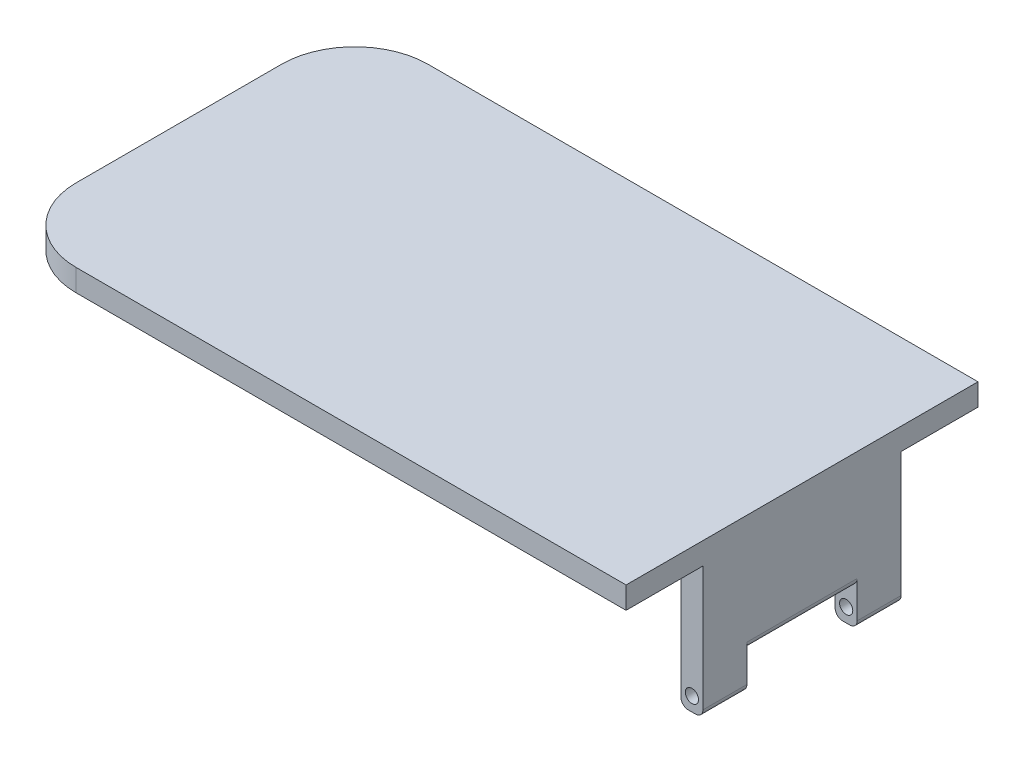
ISO-10303-21;
HEADER;
FILE_DESCRIPTION(('STEP AP214'),'2;1');
FILE_NAME('part.step','',(''),(''),'','','');
FILE_SCHEMA(('AUTOMOTIVE_DESIGN { 1 0 10303 214 1 1 1 1 }'));
ENDSEC;
DATA;
#1=APPLICATION_CONTEXT('core data for automotive mechanical design processes');
#2=APPLICATION_PROTOCOL_DEFINITION('international standard','automotive_design',2000,#1);
#3=PRODUCT_CONTEXT('',#1,'mechanical');
#4=PRODUCT('Part','Part','',(#3));
#5=PRODUCT_RELATED_PRODUCT_CATEGORY('part','',(#4));
#6=PRODUCT_DEFINITION_FORMATION('','',#4);
#7=PRODUCT_DEFINITION_CONTEXT('part definition',#1,'design');
#8=PRODUCT_DEFINITION('design','',#6,#7);
#9=PRODUCT_DEFINITION_SHAPE('','',#8);
#10=(LENGTH_UNIT() NAMED_UNIT(*) SI_UNIT(.MILLI.,.METRE.));
#11=(NAMED_UNIT(*) PLANE_ANGLE_UNIT() SI_UNIT($,.RADIAN.));
#12=(NAMED_UNIT(*) SI_UNIT($,.STERADIAN.) SOLID_ANGLE_UNIT());
#13=UNCERTAINTY_MEASURE_WITH_UNIT(LENGTH_MEASURE(1.E-05),#10,'distance_accuracy_value','');
#14=(GEOMETRIC_REPRESENTATION_CONTEXT(3) GLOBAL_UNCERTAINTY_ASSIGNED_CONTEXT((#13)) GLOBAL_UNIT_ASSIGNED_CONTEXT((#10,
#11,#12)) REPRESENTATION_CONTEXT('',''));
#15=CARTESIAN_POINT('',(0.,0.,0.));
#16=DIRECTION('',(0.,0.,1.));
#17=DIRECTION('',(1.,0.,0.));
#18=AXIS2_PLACEMENT_3D('',#15,#16,#17);
#19=CARTESIAN_POINT('',(0.,-3.,0.));
#20=DIRECTION('',(0.,-1.,0.));
#21=DIRECTION('',(0.,0.,-1.));
#22=AXIS2_PLACEMENT_3D('',#19,#20,#21);
#23=PLANE('',#22);
#24=DIRECTION('',(1.,0.,0.));
#25=VECTOR('',#24,1.);
#26=CARTESIAN_POINT('',(-42.5,-3.,24.));
#27=LINE('',#26,#25);
#28=CARTESIAN_POINT('',(-32.5,-3.,24.));
#29=VERTEX_POINT('',#28);
#30=CARTESIAN_POINT('',(2.21,-3.,24.));
#31=VERTEX_POINT('',#30);
#32=EDGE_CURVE('E344',#29,#31,#27,.T.);
#33=ORIENTED_EDGE('',*,*,#32,.F.);
#34=CARTESIAN_POINT('',(-32.5,-3.,14.));
#35=DIRECTION('',(0.,-1.,0.));
#36=DIRECTION('',(0.,0.,-1.));
#37=AXIS2_PLACEMENT_3D('',#34,#35,#36);
#38=CIRCLE('',#37,10.);
#39=CARTESIAN_POINT('',(-42.5,-3.,14.));
#40=VERTEX_POINT('',#39);
#41=EDGE_CURVE('E41',#29,#40,#38,.T.);
#42=ORIENTED_EDGE('',*,*,#41,.T.);
#43=DIRECTION('',(0.,0.,1.));
#44=VECTOR('',#43,1.);
#45=CARTESIAN_POINT('',(-42.5,-3.,-24.));
#46=LINE('',#45,#44);
#47=CARTESIAN_POINT('',(-42.5,-3.,-14.));
#48=VERTEX_POINT('',#47);
#49=EDGE_CURVE('E346',#48,#40,#46,.T.);
#50=ORIENTED_EDGE('',*,*,#49,.F.);
#51=CARTESIAN_POINT('',(-32.5,-3.,-14.));
#52=DIRECTION('',(0.,-1.,0.));
#53=DIRECTION('',(0.,0.,-1.));
#54=AXIS2_PLACEMENT_3D('',#51,#52,#53);
#55=CIRCLE('',#54,10.);
#56=CARTESIAN_POINT('',(-32.5,-3.,-24.));
#57=VERTEX_POINT('',#56);
#58=EDGE_CURVE('E449',#48,#57,#55,.T.);
#59=ORIENTED_EDGE('',*,*,#58,.T.);
#60=DIRECTION('',(1.,0.,0.));
#61=VECTOR('',#60,1.);
#62=CARTESIAN_POINT('',(-42.5,-3.,-24.));
#63=LINE('',#62,#61);
#64=CARTESIAN_POINT('',(2.21,-3.,-24.));
#65=VERTEX_POINT('',#64);
#66=EDGE_CURVE('E340',#57,#65,#63,.T.);
#67=ORIENTED_EDGE('',*,*,#66,.T.);
#68=CARTESIAN_POINT('',(2.21,-3.,0.));
#69=DIRECTION('',(0.,-1.,0.));
#70=DIRECTION('',(0.,0.,-1.));
#71=AXIS2_PLACEMENT_3D('',#68,#69,#70);
#72=CIRCLE('',#71,24.);
#73=EDGE_CURVE('E438',#65,#31,#72,.F.);
#74=ORIENTED_EDGE('',*,*,#73,.T.);
#75=EDGE_LOOP('',(#33,#42,#50,#59,#67,#74));
#76=FACE_BOUND('',#75,.T.);
#77=DIRECTION('',(1.,0.,0.));
#78=VECTOR('',#77,1.);
#79=CARTESIAN_POINT('',(-28.5,-3.,-6.89778775518108));
#80=LINE('',#79,#78);
#81=CARTESIAN_POINT('',(-28.5,-3.,-6.89778775518108));
#82=VERTEX_POINT('',#81);
#83=CARTESIAN_POINT('',(-22.5,-3.,-6.89778775518108));
#84=VERTEX_POINT('',#83);
#85=EDGE_CURVE('E252',#82,#84,#80,.T.);
#86=ORIENTED_EDGE('',*,*,#85,.F.);
#87=DIRECTION('',(0.,0.,-1.));
#88=VECTOR('',#87,1.);
#89=CARTESIAN_POINT('',(-28.5,-3.,-6.89778775518108));
#90=LINE('',#89,#88);
#91=CARTESIAN_POINT('',(-28.5,-3.,-2.50000000000001));
#92=VERTEX_POINT('',#91);
#93=EDGE_CURVE('E249',#92,#82,#90,.T.);
#94=ORIENTED_EDGE('',*,*,#93,.F.);
#95=DIRECTION('',(-1.,0.,0.));
#96=VECTOR('',#95,1.);
#97=CARTESIAN_POINT('',(-28.5,-3.,-2.50000000000001));
#98=LINE('',#97,#96);
#99=CARTESIAN_POINT('',(-22.5,-3.,-2.50000000000001));
#100=VERTEX_POINT('',#99);
#101=EDGE_CURVE('E261',#100,#92,#98,.T.);
#102=ORIENTED_EDGE('',*,*,#101,.F.);
#103=DIRECTION('',(0.,0.,1.));
#104=VECTOR('',#103,1.);
#105=CARTESIAN_POINT('',(-22.5,-3.,-6.89778775518108));
#106=LINE('',#105,#104);
#107=EDGE_CURVE('E269',#84,#100,#106,.T.);
#108=ORIENTED_EDGE('',*,*,#107,.F.);
#109=EDGE_LOOP('',(#86,#94,#102,#108));
#110=FACE_BOUND('',#109,.T.);
#111=DIRECTION('',(1.,0.,0.));
#112=VECTOR('',#111,1.);
#113=CARTESIAN_POINT('',(-28.5,-3.,2.49999999999999));
#114=LINE('',#113,#112);
#115=CARTESIAN_POINT('',(-28.5,-3.,2.49999999999999));
#116=VERTEX_POINT('',#115);
#117=CARTESIAN_POINT('',(-22.5,-3.,2.49999999999999));
#118=VERTEX_POINT('',#117);
#119=EDGE_CURVE('E770',#116,#118,#114,.T.);
#120=ORIENTED_EDGE('',*,*,#119,.F.);
#121=DIRECTION('',(0.,0.,-1.));
#122=VECTOR('',#121,1.);
#123=CARTESIAN_POINT('',(-28.5,-3.,2.49999999999999));
#124=LINE('',#123,#122);
#125=CARTESIAN_POINT('',(-28.5,-3.,6.85717531390623));
#126=VERTEX_POINT('',#125);
#127=EDGE_CURVE('E247',#126,#116,#124,.T.);
#128=ORIENTED_EDGE('',*,*,#127,.F.);
#129=DIRECTION('',(-1.,0.,0.));
#130=VECTOR('',#129,1.);
#131=CARTESIAN_POINT('',(-28.5,-3.,6.85717531390623));
#132=LINE('',#131,#130);
#133=CARTESIAN_POINT('',(-22.5,-3.,6.85717531390623));
#134=VERTEX_POINT('',#133);
#135=EDGE_CURVE('E243',#134,#126,#132,.T.);
#136=ORIENTED_EDGE('',*,*,#135,.F.);
#137=DIRECTION('',(0.,0.,1.));
#138=VECTOR('',#137,1.);
#139=CARTESIAN_POINT('',(-22.5,-3.,2.49999999999999));
#140=LINE('',#139,#138);
#141=EDGE_CURVE('E780',#118,#134,#140,.T.);
#142=ORIENTED_EDGE('',*,*,#141,.F.);
#143=EDGE_LOOP('',(#120,#128,#136,#142));
#144=FACE_BOUND('',#143,.T.);
#145=ADVANCED_FACE('F33',(#76,#110,#144),#23,.T.);
#146=CARTESIAN_POINT('',(-32.5,-3.,14.));
#147=DIRECTION('',(0.,1.,0.));
#148=DIRECTION('',(0.,0.,1.));
#149=AXIS2_PLACEMENT_3D('',#146,#147,#148);
#150=CYLINDRICAL_SURFACE('',#149,10.);
#151=DIRECTION('',(0.,1.,0.));
#152=VECTOR('',#151,1.);
#153=CARTESIAN_POINT('',(-42.5,-3.,14.));
#154=LINE('',#153,#152);
#155=CARTESIAN_POINT('',(-42.5,0.,14.));
#156=VERTEX_POINT('',#155);
#157=EDGE_CURVE('E451',#40,#156,#154,.T.);
#158=ORIENTED_EDGE('',*,*,#157,.F.);
#159=ORIENTED_EDGE('',*,*,#41,.F.);
#160=DIRECTION('',(0.,1.,0.));
#161=VECTOR('',#160,1.);
#162=CARTESIAN_POINT('',(-32.5,-3.,24.));
#163=LINE('',#162,#161);
#164=CARTESIAN_POINT('',(-32.5,0.,24.));
#165=VERTEX_POINT('',#164);
#166=EDGE_CURVE('E454',#165,#29,#163,.F.);
#167=ORIENTED_EDGE('',*,*,#166,.F.);
#168=CARTESIAN_POINT('',(-32.5,0.,14.));
#169=DIRECTION('',(0.,-1.,0.));
#170=DIRECTION('',(0.,0.,-1.));
#171=AXIS2_PLACEMENT_3D('',#168,#169,#170);
#172=CIRCLE('',#171,10.);
#173=EDGE_CURVE('E11',#156,#165,#172,.F.);
#174=ORIENTED_EDGE('',*,*,#173,.F.);
#175=EDGE_LOOP('',(#158,#159,#167,#174));
#176=FACE_BOUND('',#175,.T.);
#177=ADVANCED_FACE('F35',(#176),#150,.T.);
#178=CARTESIAN_POINT('',(-32.5,-3.,-14.));
#179=DIRECTION('',(0.,1.,0.));
#180=DIRECTION('',(0.,0.,1.));
#181=AXIS2_PLACEMENT_3D('',#178,#179,#180);
#182=CYLINDRICAL_SURFACE('',#181,10.);
#183=DIRECTION('',(0.,-1.,0.));
#184=VECTOR('',#183,1.);
#185=CARTESIAN_POINT('',(-42.5,-3.,-14.));
#186=LINE('',#185,#184);
#187=CARTESIAN_POINT('',(-42.5,0.,-14.));
#188=VERTEX_POINT('',#187);
#189=EDGE_CURVE('E441',#188,#48,#186,.T.);
#190=ORIENTED_EDGE('',*,*,#189,.F.);
#191=CARTESIAN_POINT('',(-32.5,0.,-14.));
#192=DIRECTION('',(0.,-1.,0.));
#193=DIRECTION('',(0.,0.,-1.));
#194=AXIS2_PLACEMENT_3D('',#191,#192,#193);
#195=CIRCLE('',#194,10.);
#196=CARTESIAN_POINT('',(-32.5,0.,-24.));
#197=VERTEX_POINT('',#196);
#198=EDGE_CURVE('E447',#197,#188,#195,.F.);
#199=ORIENTED_EDGE('',*,*,#198,.F.);
#200=DIRECTION('',(0.,-1.,0.));
#201=VECTOR('',#200,1.);
#202=CARTESIAN_POINT('',(-32.5,-3.,-24.));
#203=LINE('',#202,#201);
#204=EDGE_CURVE('E444',#57,#197,#203,.F.);
#205=ORIENTED_EDGE('',*,*,#204,.F.);
#206=ORIENTED_EDGE('',*,*,#58,.F.);
#207=EDGE_LOOP('',(#190,#199,#205,#206));
#208=FACE_BOUND('',#207,.T.);
#209=ADVANCED_FACE('F468',(#208),#182,.T.);
#210=CARTESIAN_POINT('',(40.5,-15.,7.52));
#211=DIRECTION('',(0.,0.,1.));
#212=DIRECTION('',(1.,0.,0.));
#213=AXIS2_PLACEMENT_3D('',#210,#211,#212);
#214=CYLINDRICAL_SURFACE('',#213,1.);
#215=DIRECTION('',(0.,0.,-1.));
#216=VECTOR('',#215,1.);
#217=CARTESIAN_POINT('',(40.5,-16.,7.52));
#218=LINE('',#217,#216);
#219=CARTESIAN_POINT('',(40.5,-16.,7.52));
#220=VERTEX_POINT('',#219);
#221=CARTESIAN_POINT('',(40.5,-16.,-7.52));
#222=VERTEX_POINT('',#221);
#223=EDGE_CURVE('E424',#220,#222,#218,.T.);
#224=ORIENTED_EDGE('',*,*,#223,.F.);
#225=CARTESIAN_POINT('',(40.5,-15.,7.52));
#226=DIRECTION('',(0.,0.,1.));
#227=DIRECTION('',(0.,-1.,0.));
#228=AXIS2_PLACEMENT_3D('',#225,#226,#227);
#229=CIRCLE('',#228,1.);
#230=CARTESIAN_POINT('',(39.5,-15.,7.52));
#231=VERTEX_POINT('',#230);
#232=EDGE_CURVE('E430',#220,#231,#229,.F.);
#233=ORIENTED_EDGE('',*,*,#232,.T.);
#234=DIRECTION('',(0.,0.,-1.));
#235=VECTOR('',#234,1.);
#236=CARTESIAN_POINT('',(39.5,-15.,7.52));
#237=LINE('',#236,#235);
#238=CARTESIAN_POINT('',(39.5,-15.,-7.52));
#239=VERTEX_POINT('',#238);
#240=EDGE_CURVE('E427',#239,#231,#237,.F.);
#241=ORIENTED_EDGE('',*,*,#240,.F.);
#242=CARTESIAN_POINT('',(40.5,-15.,-7.52));
#243=DIRECTION('',(0.,0.,1.));
#244=DIRECTION('',(1.,0.,0.));
#245=AXIS2_PLACEMENT_3D('',#242,#243,#244);
#246=CIRCLE('',#245,1.);
#247=EDGE_CURVE('E433',#239,#222,#246,.T.);
#248=ORIENTED_EDGE('',*,*,#247,.T.);
#249=EDGE_LOOP('',(#224,#233,#241,#248));
#250=FACE_BOUND('',#249,.T.);
#251=ADVANCED_FACE('F552',(#250),#214,.T.);
#252=CARTESIAN_POINT('',(41.5,-15.,7.52));
#253=DIRECTION('',(0.,0.,-1.));
#254=DIRECTION('',(-1.,0.,0.));
#255=AXIS2_PLACEMENT_3D('',#252,#253,#254);
#256=CYLINDRICAL_SURFACE('',#255,1.);
#257=DIRECTION('',(0.,0.,1.));
#258=VECTOR('',#257,1.);
#259=CARTESIAN_POINT('',(41.5,-16.,7.52));
#260=LINE('',#259,#258);
#261=CARTESIAN_POINT('',(41.5,-16.,-7.52));
#262=VERTEX_POINT('',#261);
#263=CARTESIAN_POINT('',(41.5,-16.,7.52));
#264=VERTEX_POINT('',#263);
#265=EDGE_CURVE('E412',#262,#264,#260,.T.);
#266=ORIENTED_EDGE('',*,*,#265,.F.);
#267=CARTESIAN_POINT('',(41.5,-15.,-7.52));
#268=DIRECTION('',(0.,0.,1.));
#269=DIRECTION('',(1.,0.,0.));
#270=AXIS2_PLACEMENT_3D('',#267,#268,#269);
#271=CIRCLE('',#270,1.);
#272=CARTESIAN_POINT('',(42.5,-15.,-7.52));
#273=VERTEX_POINT('',#272);
#274=EDGE_CURVE('E418',#262,#273,#271,.T.);
#275=ORIENTED_EDGE('',*,*,#274,.T.);
#276=DIRECTION('',(0.,0.,1.));
#277=VECTOR('',#276,1.);
#278=CARTESIAN_POINT('',(42.5,-15.,7.52));
#279=LINE('',#278,#277);
#280=CARTESIAN_POINT('',(42.5,-15.,7.52));
#281=VERTEX_POINT('',#280);
#282=EDGE_CURVE('E415',#281,#273,#279,.F.);
#283=ORIENTED_EDGE('',*,*,#282,.F.);
#284=CARTESIAN_POINT('',(41.5,-15.,7.52));
#285=DIRECTION('',(0.,0.,1.));
#286=DIRECTION('',(0.,-1.,0.));
#287=AXIS2_PLACEMENT_3D('',#284,#285,#286);
#288=CIRCLE('',#287,1.);
#289=EDGE_CURVE('E421',#281,#264,#288,.F.);
#290=ORIENTED_EDGE('',*,*,#289,.T.);
#291=EDGE_LOOP('',(#266,#275,#283,#290));
#292=FACE_BOUND('',#291,.T.);
#293=ADVANCED_FACE('F548',(#292),#256,.T.);
#294=CARTESIAN_POINT('',(40.5,-20.,-24.));
#295=DIRECTION('',(0.,0.,-1.));
#296=DIRECTION('',(-1.,0.,0.));
#297=AXIS2_PLACEMENT_3D('',#294,#295,#296);
#298=CYLINDRICAL_SURFACE('',#297,1.);
#299=DIRECTION('',(0.,0.,1.));
#300=VECTOR('',#299,1.);
#301=CARTESIAN_POINT('',(39.5,-20.,-24.));
#302=LINE('',#301,#300);
#303=CARTESIAN_POINT('',(39.5,-20.,7.52));
#304=VERTEX_POINT('',#303);
#305=CARTESIAN_POINT('',(39.5,-20.,13.52));
#306=VERTEX_POINT('',#305);
#307=EDGE_CURVE('E402',#304,#306,#302,.T.);
#308=ORIENTED_EDGE('',*,*,#307,.F.);
#309=CARTESIAN_POINT('',(40.5,-20.,7.52));
#310=DIRECTION('',(0.,0.,1.));
#311=DIRECTION('',(0.,-1.,0.));
#312=AXIS2_PLACEMENT_3D('',#309,#310,#311);
#313=CIRCLE('',#312,1.);
#314=CARTESIAN_POINT('',(40.5,-21.,7.52));
#315=VERTEX_POINT('',#314);
#316=EDGE_CURVE('E408',#315,#304,#313,.F.);
#317=ORIENTED_EDGE('',*,*,#316,.F.);
#318=DIRECTION('',(0.,0.,1.));
#319=VECTOR('',#318,1.);
#320=CARTESIAN_POINT('',(40.5,-21.,-24.));
#321=LINE('',#320,#319);
#322=CARTESIAN_POINT('',(40.5,-21.,13.52));
#323=VERTEX_POINT('',#322);
#324=EDGE_CURVE('E405',#323,#315,#321,.F.);
#325=ORIENTED_EDGE('',*,*,#324,.F.);
#326=CARTESIAN_POINT('',(40.5,-20.,13.52));
#327=DIRECTION('',(0.,0.,-1.));
#328=DIRECTION('',(0.,1.,0.));
#329=AXIS2_PLACEMENT_3D('',#326,#327,#328);
#330=CIRCLE('',#329,1.);
#331=EDGE_CURVE('E410',#306,#323,#330,.F.);
#332=ORIENTED_EDGE('',*,*,#331,.F.);
#333=EDGE_LOOP('',(#308,#317,#325,#332));
#334=FACE_BOUND('',#333,.T.);
#335=ADVANCED_FACE('F544',(#334),#298,.T.);
#336=CARTESIAN_POINT('',(40.5,-20.,-24.));
#337=DIRECTION('',(0.,0.,-1.));
#338=DIRECTION('',(-1.,0.,0.));
#339=AXIS2_PLACEMENT_3D('',#336,#337,#338);
#340=CYLINDRICAL_SURFACE('',#339,1.);
#341=DIRECTION('',(0.,0.,1.));
#342=VECTOR('',#341,1.);
#343=CARTESIAN_POINT('',(39.5,-20.,-24.));
#344=LINE('',#343,#342);
#345=CARTESIAN_POINT('',(39.5,-20.,-13.52));
#346=VERTEX_POINT('',#345);
#347=CARTESIAN_POINT('',(39.5,-20.,-7.52));
#348=VERTEX_POINT('',#347);
#349=EDGE_CURVE('E391',#346,#348,#344,.T.);
#350=ORIENTED_EDGE('',*,*,#349,.F.);
#351=CARTESIAN_POINT('',(40.5,-20.,-13.52));
#352=DIRECTION('',(0.,0.,-1.));
#353=DIRECTION('',(0.,1.,0.));
#354=AXIS2_PLACEMENT_3D('',#351,#352,#353);
#355=CIRCLE('',#354,1.);
#356=CARTESIAN_POINT('',(40.5,-21.,-13.52));
#357=VERTEX_POINT('',#356);
#358=EDGE_CURVE('E400',#357,#346,#355,.T.);
#359=ORIENTED_EDGE('',*,*,#358,.F.);
#360=DIRECTION('',(0.,0.,1.));
#361=VECTOR('',#360,1.);
#362=CARTESIAN_POINT('',(40.5,-21.,-24.));
#363=LINE('',#362,#361);
#364=CARTESIAN_POINT('',(40.5,-21.,-7.52));
#365=VERTEX_POINT('',#364);
#366=EDGE_CURVE('E397',#365,#357,#363,.F.);
#367=ORIENTED_EDGE('',*,*,#366,.F.);
#368=CARTESIAN_POINT('',(40.5,-20.,-7.52));
#369=DIRECTION('',(0.,0.,1.));
#370=DIRECTION('',(1.,0.,0.));
#371=AXIS2_PLACEMENT_3D('',#368,#369,#370);
#372=CIRCLE('',#371,1.);
#373=EDGE_CURVE('E394',#348,#365,#372,.T.);
#374=ORIENTED_EDGE('',*,*,#373,.F.);
#375=EDGE_LOOP('',(#350,#359,#367,#374));
#376=FACE_BOUND('',#375,.T.);
#377=ADVANCED_FACE('F540',(#376),#340,.T.);
#378=CARTESIAN_POINT('',(41.5,-20.,-24.));
#379=DIRECTION('',(0.,0.,1.));
#380=DIRECTION('',(1.,0.,0.));
#381=AXIS2_PLACEMENT_3D('',#378,#379,#380);
#382=CYLINDRICAL_SURFACE('',#381,1.);
#383=DIRECTION('',(0.,0.,-1.));
#384=VECTOR('',#383,1.);
#385=CARTESIAN_POINT('',(42.5,-20.,-24.));
#386=LINE('',#385,#384);
#387=CARTESIAN_POINT('',(42.5,-20.,13.52));
#388=VERTEX_POINT('',#387);
#389=CARTESIAN_POINT('',(42.5,-20.,7.52));
#390=VERTEX_POINT('',#389);
#391=EDGE_CURVE('E380',#388,#390,#386,.T.);
#392=ORIENTED_EDGE('',*,*,#391,.F.);
#393=CARTESIAN_POINT('',(41.5,-20.,13.52));
#394=DIRECTION('',(0.,0.,-1.));
#395=DIRECTION('',(0.,1.,0.));
#396=AXIS2_PLACEMENT_3D('',#393,#394,#395);
#397=CIRCLE('',#396,1.);
#398=CARTESIAN_POINT('',(41.5,-21.,13.52));
#399=VERTEX_POINT('',#398);
#400=EDGE_CURVE('E386',#399,#388,#397,.F.);
#401=ORIENTED_EDGE('',*,*,#400,.F.);
#402=DIRECTION('',(0.,0.,-1.));
#403=VECTOR('',#402,1.);
#404=CARTESIAN_POINT('',(41.5,-21.,-24.));
#405=LINE('',#404,#403);
#406=CARTESIAN_POINT('',(41.5,-21.,7.52));
#407=VERTEX_POINT('',#406);
#408=EDGE_CURVE('E383',#407,#399,#405,.F.);
#409=ORIENTED_EDGE('',*,*,#408,.F.);
#410=CARTESIAN_POINT('',(41.5,-20.,7.52));
#411=DIRECTION('',(0.,0.,1.));
#412=DIRECTION('',(0.,-1.,0.));
#413=AXIS2_PLACEMENT_3D('',#410,#411,#412);
#414=CIRCLE('',#413,1.);
#415=EDGE_CURVE('E388',#390,#407,#414,.F.);
#416=ORIENTED_EDGE('',*,*,#415,.F.);
#417=EDGE_LOOP('',(#392,#401,#409,#416));
#418=FACE_BOUND('',#417,.T.);
#419=ADVANCED_FACE('F536',(#418),#382,.T.);
#420=CARTESIAN_POINT('',(41.5,-20.,-24.));
#421=DIRECTION('',(0.,0.,1.));
#422=DIRECTION('',(1.,0.,0.));
#423=AXIS2_PLACEMENT_3D('',#420,#421,#422);
#424=CYLINDRICAL_SURFACE('',#423,1.);
#425=DIRECTION('',(0.,0.,-1.));
#426=VECTOR('',#425,1.);
#427=CARTESIAN_POINT('',(42.5,-20.,-24.));
#428=LINE('',#427,#426);
#429=CARTESIAN_POINT('',(42.5,-20.,-7.52));
#430=VERTEX_POINT('',#429);
#431=CARTESIAN_POINT('',(42.5,-20.,-13.52));
#432=VERTEX_POINT('',#431);
#433=EDGE_CURVE('E364',#430,#432,#428,.T.);
#434=ORIENTED_EDGE('',*,*,#433,.F.);
#435=CARTESIAN_POINT('',(41.5,-20.,-7.52));
#436=DIRECTION('',(0.,0.,1.));
#437=DIRECTION('',(1.,0.,0.));
#438=AXIS2_PLACEMENT_3D('',#435,#436,#437);
#439=CIRCLE('',#438,1.);
#440=CARTESIAN_POINT('',(41.5,-21.,-7.52));
#441=VERTEX_POINT('',#440);
#442=EDGE_CURVE('E376',#441,#430,#439,.T.);
#443=ORIENTED_EDGE('',*,*,#442,.F.);
#444=DIRECTION('',(0.,0.,-1.));
#445=VECTOR('',#444,1.);
#446=CARTESIAN_POINT('',(41.5,-21.,-24.));
#447=LINE('',#446,#445);
#448=CARTESIAN_POINT('',(41.5,-21.,-13.52));
#449=VERTEX_POINT('',#448);
#450=EDGE_CURVE('E373',#449,#441,#447,.F.);
#451=ORIENTED_EDGE('',*,*,#450,.F.);
#452=CARTESIAN_POINT('',(41.5,-20.,-13.52));
#453=DIRECTION('',(0.,0.,-1.));
#454=DIRECTION('',(0.,1.,0.));
#455=AXIS2_PLACEMENT_3D('',#452,#453,#454);
#456=CIRCLE('',#455,1.);
#457=EDGE_CURVE('E378',#432,#449,#456,.T.);
#458=ORIENTED_EDGE('',*,*,#457,.F.);
#459=EDGE_LOOP('',(#434,#443,#451,#458));
#460=FACE_BOUND('',#459,.T.);
#461=ADVANCED_FACE('F532',(#460),#424,.T.);
#462=CARTESIAN_POINT('',(0.,-21.,0.));
#463=DIRECTION('',(0.,-1.,0.));
#464=DIRECTION('',(0.,0.,-1.));
#465=AXIS2_PLACEMENT_3D('',#462,#463,#464);
#466=PLANE('',#465);
#467=DIRECTION('',(1.,0.,0.));
#468=VECTOR('',#467,1.);
#469=CARTESIAN_POINT('',(-42.5,-21.,-7.52));
#470=LINE('',#469,#468);
#471=EDGE_CURVE('E326',#365,#441,#470,.T.);
#472=ORIENTED_EDGE('',*,*,#471,.F.);
#473=ORIENTED_EDGE('',*,*,#366,.T.);
#474=DIRECTION('',(-1.,0.,0.));
#475=VECTOR('',#474,1.);
#476=CARTESIAN_POINT('',(42.5,-21.,-13.52));
#477=LINE('',#476,#475);
#478=EDGE_CURVE('E290',#449,#357,#477,.T.);
#479=ORIENTED_EDGE('',*,*,#478,.F.);
#480=ORIENTED_EDGE('',*,*,#450,.T.);
#481=EDGE_LOOP('',(#472,#473,#479,#480));
#482=FACE_BOUND('',#481,.T.);
#483=ADVANCED_FACE('F535',(#482),#466,.T.);
#484=CARTESIAN_POINT('',(41.,-19.1,-24.));
#485=DIRECTION('',(0.,0.,-1.));
#486=DIRECTION('',(-1.,0.,0.));
#487=AXIS2_PLACEMENT_3D('',#484,#485,#486);
#488=CYLINDRICAL_SURFACE('',#487,0.899999999999991);
#489=CARTESIAN_POINT('',(41.,-19.1,-7.52));
#490=DIRECTION('',(0.,0.,1.));
#491=DIRECTION('',(1.,0.,0.));
#492=AXIS2_PLACEMENT_3D('',#489,#490,#491);
#493=CIRCLE('',#492,0.899999999999991);
#494=CARTESIAN_POINT('',(41.9,-19.1,-7.52));
#495=VERTEX_POINT('',#494);
#496=EDGE_CURVE('E323',#495,#495,#493,.F.);
#497=ORIENTED_EDGE('',*,*,#496,.F.);
#498=EDGE_LOOP('',(#497));
#499=FACE_BOUND('',#498,.T.);
#500=CARTESIAN_POINT('',(41.,-19.1,-13.52));
#501=DIRECTION('',(0.,0.,-1.));
#502=DIRECTION('',(0.,1.,0.));
#503=AXIS2_PLACEMENT_3D('',#500,#501,#502);
#504=CIRCLE('',#503,0.899999999999991);
#505=CARTESIAN_POINT('',(41.,-18.2,-13.52));
#506=VERTEX_POINT('',#505);
#507=EDGE_CURVE('E311',#506,#506,#504,.F.);
#508=ORIENTED_EDGE('',*,*,#507,.F.);
#509=EDGE_LOOP('',(#508));
#510=FACE_BOUND('',#509,.T.);
#511=ADVANCED_FACE('F531',(#499,#510),#488,.F.);
#512=CARTESIAN_POINT('',(-42.5,-3.,-24.));
#513=DIRECTION('',(0.,0.,1.));
#514=DIRECTION('',(1.,0.,0.));
#515=AXIS2_PLACEMENT_3D('',#512,#513,#514);
#516=PLANE('',#515);
#517=ORIENTED_EDGE('',*,*,#66,.F.);
#518=ORIENTED_EDGE('',*,*,#204,.T.);
#519=DIRECTION('',(1.,0.,0.));
#520=VECTOR('',#519,1.);
#521=CARTESIAN_POINT('',(-42.5,0.,-24.));
#522=LINE('',#521,#520);
#523=CARTESIAN_POINT('',(42.5,0.,-24.));
#524=VERTEX_POINT('',#523);
#525=EDGE_CURVE('E339',#197,#524,#522,.T.);
#526=ORIENTED_EDGE('',*,*,#525,.T.);
#527=DIRECTION('',(0.,1.,0.));
#528=VECTOR('',#527,1.);
#529=CARTESIAN_POINT('',(42.5,-3.,-24.));
#530=LINE('',#529,#528);
#531=CARTESIAN_POINT('',(42.5,-3.,-24.));
#532=VERTEX_POINT('',#531);
#533=EDGE_CURVE('E361',#532,#524,#530,.T.);
#534=ORIENTED_EDGE('',*,*,#533,.F.);
#535=EDGE_CURVE('E343',#65,#532,#63,.T.);
#536=ORIENTED_EDGE('',*,*,#535,.F.);
#537=EDGE_LOOP('',(#517,#518,#526,#534,#536));
#538=FACE_BOUND('',#537,.T.);
#539=ADVANCED_FACE('F482',(#538),#516,.F.);
#540=CARTESIAN_POINT('',(42.5,-3.,-24.));
#541=DIRECTION('',(-1.,0.,0.));
#542=DIRECTION('',(0.,0.,1.));
#543=AXIS2_PLACEMENT_3D('',#540,#541,#542);
#544=PLANE('',#543);
#545=ORIENTED_EDGE('',*,*,#282,.T.);
#546=DIRECTION('',(0.,-1.,0.));
#547=VECTOR('',#546,1.);
#548=CARTESIAN_POINT('',(42.5,-16.,-7.52));
#549=LINE('',#548,#547);
#550=EDGE_CURVE('E317',#273,#430,#549,.T.);
#551=ORIENTED_EDGE('',*,*,#550,.T.);
#552=ORIENTED_EDGE('',*,*,#433,.T.);
#553=DIRECTION('',(0.,-1.,0.));
#554=VECTOR('',#553,1.);
#555=CARTESIAN_POINT('',(42.5,-3.00000000000001,-13.52));
#556=LINE('',#555,#554);
#557=CARTESIAN_POINT('',(42.5,-3.00000000000001,-13.52));
#558=VERTEX_POINT('',#557);
#559=EDGE_CURVE('E284',#558,#432,#556,.T.);
#560=ORIENTED_EDGE('',*,*,#559,.F.);
#561=DIRECTION('',(0.,0.,1.));
#562=VECTOR('',#561,1.);
#563=CARTESIAN_POINT('',(42.5,-3.,-24.));
#564=LINE('',#563,#562);
#565=EDGE_CURVE('E287',#532,#558,#564,.T.);
#566=ORIENTED_EDGE('',*,*,#565,.F.);
#567=ORIENTED_EDGE('',*,*,#533,.T.);
#568=DIRECTION('',(0.,0.,1.));
#569=VECTOR('',#568,1.);
#570=CARTESIAN_POINT('',(42.5,0.,-24.));
#571=LINE('',#570,#569);
#572=CARTESIAN_POINT('',(42.5,0.,24.));
#573=VERTEX_POINT('',#572);
#574=EDGE_CURVE('E351',#524,#573,#571,.T.);
#575=ORIENTED_EDGE('',*,*,#574,.T.);
#576=DIRECTION('',(0.,1.,0.));
#577=VECTOR('',#576,1.);
#578=CARTESIAN_POINT('',(42.5,-3.,24.));
#579=LINE('',#578,#577);
#580=CARTESIAN_POINT('',(42.5,-3.,24.));
#581=VERTEX_POINT('',#580);
#582=EDGE_CURVE('E349',#581,#573,#579,.T.);
#583=ORIENTED_EDGE('',*,*,#582,.F.);
#584=DIRECTION('',(0.,0.,-1.));
#585=VECTOR('',#584,1.);
#586=CARTESIAN_POINT('',(42.5,-3.,24.));
#587=LINE('',#586,#585);
#588=CARTESIAN_POINT('',(42.5,-3.,13.52));
#589=VERTEX_POINT('',#588);
#590=EDGE_CURVE('E303',#581,#589,#587,.T.);
#591=ORIENTED_EDGE('',*,*,#590,.T.);
#592=DIRECTION('',(0.,-1.,0.));
#593=VECTOR('',#592,1.);
#594=CARTESIAN_POINT('',(42.5,-3.,13.52));
#595=LINE('',#594,#593);
#596=EDGE_CURVE('E306',#589,#388,#595,.T.);
#597=ORIENTED_EDGE('',*,*,#596,.T.);
#598=ORIENTED_EDGE('',*,*,#391,.T.);
#599=DIRECTION('',(0.,-1.,0.));
#600=VECTOR('',#599,1.);
#601=CARTESIAN_POINT('',(42.5,-16.,7.52));
#602=LINE('',#601,#600);
#603=EDGE_CURVE('E314',#281,#390,#602,.T.);
#604=ORIENTED_EDGE('',*,*,#603,.F.);
#605=EDGE_LOOP('',(#545,#551,#552,#560,#566,#567,#575,#583,#591,#597,#598,#604));
#606=FACE_BOUND('',#605,.T.);
#607=ADVANCED_FACE('F525',(#606),#544,.F.);
#608=CARTESIAN_POINT('',(39.5,-21.,-24.));
#609=DIRECTION('',(1.,0.,0.));
#610=DIRECTION('',(0.,0.,-1.));
#611=AXIS2_PLACEMENT_3D('',#608,#609,#610);
#612=PLANE('',#611);
#613=ORIENTED_EDGE('',*,*,#240,.T.);
#614=DIRECTION('',(0.,-1.,0.));
#615=VECTOR('',#614,1.);
#616=CARTESIAN_POINT('',(39.5,-21.,7.52));
#617=LINE('',#616,#615);
#618=EDGE_CURVE('E333',#231,#304,#617,.T.);
#619=ORIENTED_EDGE('',*,*,#618,.T.);
#620=ORIENTED_EDGE('',*,*,#307,.T.);
#621=DIRECTION('',(0.,-1.,0.));
#622=VECTOR('',#621,1.);
#623=CARTESIAN_POINT('',(39.5,-3.,13.52));
#624=LINE('',#623,#622);
#625=CARTESIAN_POINT('',(39.5,-3.,13.52));
#626=VERTEX_POINT('',#625);
#627=EDGE_CURVE('E293',#626,#306,#624,.T.);
#628=ORIENTED_EDGE('',*,*,#627,.F.);
#629=DIRECTION('',(0.,0.,-1.));
#630=VECTOR('',#629,1.);
#631=CARTESIAN_POINT('',(39.5,-3.,-24.));
#632=LINE('',#631,#630);
#633=CARTESIAN_POINT('',(39.5,-3.00000000000001,-13.52));
#634=VERTEX_POINT('',#633);
#635=EDGE_CURVE('E336',#626,#634,#632,.T.);
#636=ORIENTED_EDGE('',*,*,#635,.T.);
#637=DIRECTION('',(0.,-1.,0.));
#638=VECTOR('',#637,1.);
#639=CARTESIAN_POINT('',(39.5,-3.00000000000001,-13.52));
#640=LINE('',#639,#638);
#641=EDGE_CURVE('E288',#634,#346,#640,.T.);
#642=ORIENTED_EDGE('',*,*,#641,.T.);
#643=ORIENTED_EDGE('',*,*,#349,.T.);
#644=DIRECTION('',(0.,-1.,0.));
#645=VECTOR('',#644,1.);
#646=CARTESIAN_POINT('',(39.5,-21.,-7.52));
#647=LINE('',#646,#645);
#648=EDGE_CURVE('E329',#239,#348,#647,.T.);
#649=ORIENTED_EDGE('',*,*,#648,.F.);
#650=EDGE_LOOP('',(#613,#619,#620,#628,#636,#642,#643,#649));
#651=FACE_BOUND('',#650,.T.);
#652=ADVANCED_FACE('F521',(#651),#612,.F.);
#653=CARTESIAN_POINT('',(-42.5,-3.,24.));
#654=DIRECTION('',(0.,0.,1.));
#655=DIRECTION('',(1.,0.,0.));
#656=AXIS2_PLACEMENT_3D('',#653,#654,#655);
#657=PLANE('',#656);
#658=DIRECTION('',(1.,0.,0.));
#659=VECTOR('',#658,1.);
#660=CARTESIAN_POINT('',(-42.5,0.,24.));
#661=LINE('',#660,#659);
#662=EDGE_CURVE('E354',#165,#573,#661,.T.);
#663=ORIENTED_EDGE('',*,*,#662,.F.);
#664=ORIENTED_EDGE('',*,*,#166,.T.);
#665=ORIENTED_EDGE('',*,*,#32,.T.);
#666=EDGE_CURVE('E342',#31,#581,#27,.T.);
#667=ORIENTED_EDGE('',*,*,#666,.T.);
#668=ORIENTED_EDGE('',*,*,#582,.T.);
#669=EDGE_LOOP('',(#663,#664,#665,#667,#668));
#670=FACE_BOUND('',#669,.T.);
#671=ADVANCED_FACE('F516',(#670),#657,.T.);
#672=CARTESIAN_POINT('',(-42.5,-3.,-24.));
#673=DIRECTION('',(-1.,0.,0.));
#674=DIRECTION('',(0.,0.,1.));
#675=AXIS2_PLACEMENT_3D('',#672,#673,#674);
#676=PLANE('',#675);
#677=ORIENTED_EDGE('',*,*,#49,.T.);
#678=ORIENTED_EDGE('',*,*,#157,.T.);
#679=DIRECTION('',(0.,0.,1.));
#680=VECTOR('',#679,1.);
#681=CARTESIAN_POINT('',(-42.5,0.,-24.));
#682=LINE('',#681,#680);
#683=EDGE_CURVE('E356',#188,#156,#682,.T.);
#684=ORIENTED_EDGE('',*,*,#683,.F.);
#685=ORIENTED_EDGE('',*,*,#189,.T.);
#686=EDGE_LOOP('',(#677,#678,#684,#685));
#687=FACE_BOUND('',#686,.T.);
#688=ADVANCED_FACE('F465',(#687),#676,.T.);
#689=ORIENTED_EDGE('',*,*,#666,.F.);
#690=CARTESIAN_POINT('',(2.21,-3.,0.));
#691=DIRECTION('',(0.,-1.,0.));
#692=DIRECTION('',(0.,0.,-1.));
#693=AXIS2_PLACEMENT_3D('',#690,#691,#692);
#694=CIRCLE('',#693,24.);
#695=EDGE_CURVE('E435',#31,#65,#694,.F.);
#696=ORIENTED_EDGE('',*,*,#695,.T.);
#697=ORIENTED_EDGE('',*,*,#535,.T.);
#698=ORIENTED_EDGE('',*,*,#565,.T.);
#699=DIRECTION('',(-1.,0.,0.));
#700=VECTOR('',#699,1.);
#701=CARTESIAN_POINT('',(42.5,-3.00000000000001,-13.52));
#702=LINE('',#701,#700);
#703=EDGE_CURVE('E294',#558,#634,#702,.T.);
#704=ORIENTED_EDGE('',*,*,#703,.T.);
#705=ORIENTED_EDGE('',*,*,#635,.F.);
#706=DIRECTION('',(-1.,0.,0.));
#707=VECTOR('',#706,1.);
#708=CARTESIAN_POINT('',(42.5,-3.,13.52));
#709=LINE('',#708,#707);
#710=EDGE_CURVE('E301',#589,#626,#709,.T.);
#711=ORIENTED_EDGE('',*,*,#710,.F.);
#712=ORIENTED_EDGE('',*,*,#590,.F.);
#713=EDGE_LOOP('',(#689,#696,#697,#698,#704,#705,#711,#712));
#714=FACE_BOUND('',#713,.T.);
#715=ADVANCED_FACE('F477',(#714),#23,.T.);
#716=CARTESIAN_POINT('',(0.,0.,0.));
#717=DIRECTION('',(0.,-1.,0.));
#718=DIRECTION('',(0.,0.,-1.));
#719=AXIS2_PLACEMENT_3D('',#716,#717,#718);
#720=PLANE('',#719);
#721=ORIENTED_EDGE('',*,*,#683,.T.);
#722=ORIENTED_EDGE('',*,*,#173,.T.);
#723=ORIENTED_EDGE('',*,*,#662,.T.);
#724=ORIENTED_EDGE('',*,*,#574,.F.);
#725=ORIENTED_EDGE('',*,*,#525,.F.);
#726=ORIENTED_EDGE('',*,*,#198,.T.);
#727=EDGE_LOOP('',(#721,#722,#723,#724,#725,#726));
#728=FACE_BOUND('',#727,.T.);
#729=ADVANCED_FACE('F509',(#728),#720,.F.);
#730=DIRECTION('',(-1.,0.,0.));
#731=VECTOR('',#730,1.);
#732=CARTESIAN_POINT('',(42.5,-21.,13.52));
#733=LINE('',#732,#731);
#734=EDGE_CURVE('E283',#399,#323,#733,.T.);
#735=ORIENTED_EDGE('',*,*,#734,.T.);
#736=ORIENTED_EDGE('',*,*,#324,.T.);
#737=DIRECTION('',(1.,0.,0.));
#738=VECTOR('',#737,1.);
#739=CARTESIAN_POINT('',(-42.5,-21.,7.52));
#740=LINE('',#739,#738);
#741=EDGE_CURVE('E320',#315,#407,#740,.T.);
#742=ORIENTED_EDGE('',*,*,#741,.T.);
#743=ORIENTED_EDGE('',*,*,#408,.T.);
#744=EDGE_LOOP('',(#735,#736,#742,#743));
#745=FACE_BOUND('',#744,.T.);
#746=ADVANCED_FACE('F514',(#745),#466,.T.);
#747=CARTESIAN_POINT('',(41.,-19.1,13.52));
#748=DIRECTION('',(0.,0.,-1.));
#749=DIRECTION('',(0.,1.,0.));
#750=AXIS2_PLACEMENT_3D('',#747,#748,#749);
#751=CIRCLE('',#750,0.899999999999991);
#752=CARTESIAN_POINT('',(41.,-18.2,13.52));
#753=VERTEX_POINT('',#752);
#754=EDGE_CURVE('E296',#753,#753,#751,.F.);
#755=ORIENTED_EDGE('',*,*,#754,.T.);
#756=EDGE_LOOP('',(#755));
#757=FACE_BOUND('',#756,.T.);
#758=CARTESIAN_POINT('',(41.,-19.1,7.52));
#759=DIRECTION('',(0.,0.,1.));
#760=DIRECTION('',(0.,-1.,0.));
#761=AXIS2_PLACEMENT_3D('',#758,#759,#760);
#762=CIRCLE('',#761,0.899999999999991);
#763=CARTESIAN_POINT('',(41.,-20.,7.52));
#764=VERTEX_POINT('',#763);
#765=EDGE_CURVE('E332',#764,#764,#762,.F.);
#766=ORIENTED_EDGE('',*,*,#765,.T.);
#767=EDGE_LOOP('',(#766));
#768=FACE_BOUND('',#767,.T.);
#769=ADVANCED_FACE('F607',(#757,#768),#488,.F.);
#770=CARTESIAN_POINT('',(-42.5,-16.,7.52));
#771=DIRECTION('',(0.,-1.,0.));
#772=DIRECTION('',(0.,0.,-1.));
#773=AXIS2_PLACEMENT_3D('',#770,#771,#772);
#774=PLANE('',#773);
#775=DIRECTION('',(1.,0.,0.));
#776=VECTOR('',#775,1.);
#777=CARTESIAN_POINT('',(-42.5,-16.,7.52));
#778=LINE('',#777,#776);
#779=EDGE_CURVE('E321',#220,#264,#778,.T.);
#780=ORIENTED_EDGE('',*,*,#779,.F.);
#781=ORIENTED_EDGE('',*,*,#223,.T.);
#782=DIRECTION('',(1.,0.,0.));
#783=VECTOR('',#782,1.);
#784=CARTESIAN_POINT('',(-42.5,-16.,-7.52));
#785=LINE('',#784,#783);
#786=EDGE_CURVE('E324',#222,#262,#785,.T.);
#787=ORIENTED_EDGE('',*,*,#786,.T.);
#788=ORIENTED_EDGE('',*,*,#265,.T.);
#789=EDGE_LOOP('',(#780,#781,#787,#788));
#790=FACE_BOUND('',#789,.T.);
#791=ADVANCED_FACE('F833',(#790),#774,.T.);
#792=CARTESIAN_POINT('',(-42.5,-16.,7.52));
#793=DIRECTION('',(0.,0.,1.));
#794=DIRECTION('',(0.,-1.,0.));
#795=AXIS2_PLACEMENT_3D('',#792,#793,#794);
#796=PLANE('',#795);
#797=ORIENTED_EDGE('',*,*,#765,.F.);
#798=EDGE_LOOP('',(#797));
#799=FACE_BOUND('',#798,.T.);
#800=ORIENTED_EDGE('',*,*,#741,.F.);
#801=ORIENTED_EDGE('',*,*,#316,.T.);
#802=ORIENTED_EDGE('',*,*,#618,.F.);
#803=ORIENTED_EDGE('',*,*,#232,.F.);
#804=ORIENTED_EDGE('',*,*,#779,.T.);
#805=ORIENTED_EDGE('',*,*,#289,.F.);
#806=ORIENTED_EDGE('',*,*,#603,.T.);
#807=ORIENTED_EDGE('',*,*,#415,.T.);
#808=EDGE_LOOP('',(#800,#801,#802,#803,#804,#805,#806,#807));
#809=FACE_BOUND('',#808,.T.);
#810=ADVANCED_FACE('F823',(#799,#809),#796,.F.);
#811=CARTESIAN_POINT('',(-42.5,-16.,-7.52));
#812=DIRECTION('',(0.,0.,1.));
#813=DIRECTION('',(1.,0.,0.));
#814=AXIS2_PLACEMENT_3D('',#811,#812,#813);
#815=PLANE('',#814);
#816=ORIENTED_EDGE('',*,*,#496,.T.);
#817=EDGE_LOOP('',(#816));
#818=FACE_BOUND('',#817,.T.);
#819=ORIENTED_EDGE('',*,*,#648,.T.);
#820=ORIENTED_EDGE('',*,*,#373,.T.);
#821=ORIENTED_EDGE('',*,*,#471,.T.);
#822=ORIENTED_EDGE('',*,*,#442,.T.);
#823=ORIENTED_EDGE('',*,*,#550,.F.);
#824=ORIENTED_EDGE('',*,*,#274,.F.);
#825=ORIENTED_EDGE('',*,*,#786,.F.);
#826=ORIENTED_EDGE('',*,*,#247,.F.);
#827=EDGE_LOOP('',(#819,#820,#821,#822,#823,#824,#825,#826));
#828=FACE_BOUND('',#827,.T.);
#829=ADVANCED_FACE('F818',(#818,#828),#815,.T.);
#830=CARTESIAN_POINT('',(42.5,-3.,13.52));
#831=DIRECTION('',(0.,0.,-1.));
#832=DIRECTION('',(0.,1.,0.));
#833=AXIS2_PLACEMENT_3D('',#830,#831,#832);
#834=PLANE('',#833);
#835=ORIENTED_EDGE('',*,*,#627,.T.);
#836=ORIENTED_EDGE('',*,*,#331,.T.);
#837=ORIENTED_EDGE('',*,*,#734,.F.);
#838=ORIENTED_EDGE('',*,*,#400,.T.);
#839=ORIENTED_EDGE('',*,*,#596,.F.);
#840=ORIENTED_EDGE('',*,*,#710,.T.);
#841=EDGE_LOOP('',(#835,#836,#837,#838,#839,#840));
#842=FACE_BOUND('',#841,.T.);
#843=ORIENTED_EDGE('',*,*,#754,.F.);
#844=EDGE_LOOP('',(#843));
#845=FACE_BOUND('',#844,.T.);
#846=ADVANCED_FACE('F497',(#842,#845),#834,.F.);
#847=CARTESIAN_POINT('',(42.5,-3.00000000000001,-13.52));
#848=DIRECTION('',(0.,0.,-1.));
#849=DIRECTION('',(0.,1.,0.));
#850=AXIS2_PLACEMENT_3D('',#847,#848,#849);
#851=PLANE('',#850);
#852=ORIENTED_EDGE('',*,*,#478,.T.);
#853=ORIENTED_EDGE('',*,*,#358,.T.);
#854=ORIENTED_EDGE('',*,*,#641,.F.);
#855=ORIENTED_EDGE('',*,*,#703,.F.);
#856=ORIENTED_EDGE('',*,*,#559,.T.);
#857=ORIENTED_EDGE('',*,*,#457,.T.);
#858=EDGE_LOOP('',(#852,#853,#854,#855,#856,#857));
#859=FACE_BOUND('',#858,.T.);
#860=ORIENTED_EDGE('',*,*,#507,.T.);
#861=EDGE_LOOP('',(#860));
#862=FACE_BOUND('',#861,.T.);
#863=ADVANCED_FACE('F492',(#859,#862),#851,.T.);
#864=CARTESIAN_POINT('',(2.21,-2.,0.));
#865=DIRECTION('',(0.,-1.,0.));
#866=DIRECTION('',(0.,0.,-1.));
#867=AXIS2_PLACEMENT_3D('',#864,#865,#866);
#868=PLANE('',#867);
#869=CARTESIAN_POINT('',(2.21,-2.,0.));
#870=DIRECTION('',(0.,-1.,0.));
#871=DIRECTION('',(0.,0.,-1.));
#872=AXIS2_PLACEMENT_3D('',#869,#870,#871);
#873=CIRCLE('',#872,23.);
#874=CARTESIAN_POINT('',(2.21,-2.,-23.));
#875=VERTEX_POINT('',#874);
#876=EDGE_CURVE('E280',#875,#875,#873,.T.);
#877=ORIENTED_EDGE('',*,*,#876,.T.);
#878=EDGE_LOOP('',(#877));
#879=FACE_BOUND('',#878,.T.);
#880=ADVANCED_FACE('F487',(#879),#868,.T.);
#881=CARTESIAN_POINT('',(2.21,-2.,0.));
#882=DIRECTION('',(0.,-1.,0.));
#883=DIRECTION('',(0.,0.,-1.));
#884=AXIS2_PLACEMENT_3D('',#881,#882,#883);
#885=TOROIDAL_SURFACE('',#884,24.,1.);
#886=ORIENTED_EDGE('',*,*,#695,.F.);
#887=ORIENTED_EDGE('',*,*,#73,.F.);
#888=EDGE_LOOP('',(#886,#887));
#889=FACE_BOUND('',#888,.T.);
#890=ORIENTED_EDGE('',*,*,#876,.F.);
#891=EDGE_LOOP('',(#890));
#892=FACE_BOUND('',#891,.T.);
#893=ADVANCED_FACE('F483',(#889,#892),#885,.T.);
#894=CARTESIAN_POINT('',(-28.5,-7.,-6.89778775518108));
#895=DIRECTION('',(1.,0.,0.));
#896=DIRECTION('',(0.,0.,-1.));
#897=AXIS2_PLACEMENT_3D('',#894,#895,#896);
#898=PLANE('',#897);
#899=ORIENTED_EDGE('',*,*,#93,.T.);
#900=DIRECTION('',(0.,1.,0.));
#901=VECTOR('',#900,1.);
#902=CARTESIAN_POINT('',(-28.5,-7.,-6.89778775518108));
#903=LINE('',#902,#901);
#904=CARTESIAN_POINT('',(-28.5,-7.,-6.89778775518108));
#905=VERTEX_POINT('',#904);
#906=EDGE_CURVE('E278',#905,#82,#903,.T.);
#907=ORIENTED_EDGE('',*,*,#906,.F.);
#908=DIRECTION('',(0.,0.,-1.));
#909=VECTOR('',#908,1.);
#910=CARTESIAN_POINT('',(-28.5,-7.,-6.89778775518108));
#911=LINE('',#910,#909);
#912=CARTESIAN_POINT('',(-28.5,-7.,-2.50000000000001));
#913=VERTEX_POINT('',#912);
#914=EDGE_CURVE('E257',#913,#905,#911,.T.);
#915=ORIENTED_EDGE('',*,*,#914,.F.);
#916=DIRECTION('',(0.,1.,0.));
#917=VECTOR('',#916,1.);
#918=CARTESIAN_POINT('',(-28.5,-7.,-2.50000000000001));
#919=LINE('',#918,#917);
#920=EDGE_CURVE('E266',#913,#92,#919,.T.);
#921=ORIENTED_EDGE('',*,*,#920,.T.);
#922=EDGE_LOOP('',(#899,#907,#915,#921));
#923=FACE_BOUND('',#922,.T.);
#924=ADVANCED_FACE('F486',(#923),#898,.F.);
#925=CARTESIAN_POINT('',(-28.5,-7.,-6.89778775518108));
#926=DIRECTION('',(0.,0.,1.));
#927=DIRECTION('',(1.,0.,0.));
#928=AXIS2_PLACEMENT_3D('',#925,#926,#927);
#929=PLANE('',#928);
#930=CARTESIAN_POINT('',(-25.5,-5.,-6.89778775518108));
#931=DIRECTION('',(0.,0.,1.));
#932=DIRECTION('',(1.,0.,0.));
#933=AXIS2_PLACEMENT_3D('',#930,#931,#932);
#934=CIRCLE('',#933,0.749999999999992);
#935=CARTESIAN_POINT('',(-24.75,-5.,-6.89778775518108));
#936=VERTEX_POINT('',#935);
#937=EDGE_CURVE('E767',#936,#936,#934,.T.);
#938=ORIENTED_EDGE('',*,*,#937,.T.);
#939=EDGE_LOOP('',(#938));
#940=FACE_BOUND('',#939,.T.);
#941=ORIENTED_EDGE('',*,*,#85,.T.);
#942=DIRECTION('',(0.,1.,0.));
#943=VECTOR('',#942,1.);
#944=CARTESIAN_POINT('',(-22.5,-7.,-6.89778775518108));
#945=LINE('',#944,#943);
#946=CARTESIAN_POINT('',(-22.5,-7.,-6.89778775518108));
#947=VERTEX_POINT('',#946);
#948=EDGE_CURVE('E275',#947,#84,#945,.T.);
#949=ORIENTED_EDGE('',*,*,#948,.F.);
#950=DIRECTION('',(1.,0.,0.));
#951=VECTOR('',#950,1.);
#952=CARTESIAN_POINT('',(-28.5,-7.,-6.89778775518108));
#953=LINE('',#952,#951);
#954=EDGE_CURVE('E260',#905,#947,#953,.T.);
#955=ORIENTED_EDGE('',*,*,#954,.F.);
#956=ORIENTED_EDGE('',*,*,#906,.T.);
#957=EDGE_LOOP('',(#941,#949,#955,#956));
#958=FACE_BOUND('',#957,.T.);
#959=ADVANCED_FACE('F654',(#940,#958),#929,.F.);
#960=CARTESIAN_POINT('',(-22.5,-7.,-6.89778775518108));
#961=DIRECTION('',(-1.,0.,0.));
#962=DIRECTION('',(0.,0.,1.));
#963=AXIS2_PLACEMENT_3D('',#960,#961,#962);
#964=PLANE('',#963);
#965=ORIENTED_EDGE('',*,*,#107,.T.);
#966=DIRECTION('',(0.,1.,0.));
#967=VECTOR('',#966,1.);
#968=CARTESIAN_POINT('',(-22.5,-7.,-2.50000000000001));
#969=LINE('',#968,#967);
#970=CARTESIAN_POINT('',(-22.5,-7.,-2.50000000000001));
#971=VERTEX_POINT('',#970);
#972=EDGE_CURVE('E56',#971,#100,#969,.T.);
#973=ORIENTED_EDGE('',*,*,#972,.F.);
#974=DIRECTION('',(0.,0.,1.));
#975=VECTOR('',#974,1.);
#976=CARTESIAN_POINT('',(-22.5,-7.,-6.89778775518108));
#977=LINE('',#976,#975);
#978=EDGE_CURVE('E263',#947,#971,#977,.T.);
#979=ORIENTED_EDGE('',*,*,#978,.F.);
#980=ORIENTED_EDGE('',*,*,#948,.T.);
#981=EDGE_LOOP('',(#965,#973,#979,#980));
#982=FACE_BOUND('',#981,.T.);
#983=ADVANCED_FACE('F661',(#982),#964,.F.);
#984=CARTESIAN_POINT('',(-28.5,-7.,-2.50000000000001));
#985=DIRECTION('',(0.,0.,-1.));
#986=DIRECTION('',(-1.,0.,0.));
#987=AXIS2_PLACEMENT_3D('',#984,#985,#986);
#988=PLANE('',#987);
#989=CARTESIAN_POINT('',(-25.5,-5.,-2.50000000000001));
#990=DIRECTION('',(0.,0.,-1.));
#991=DIRECTION('',(-1.,0.,0.));
#992=AXIS2_PLACEMENT_3D('',#989,#990,#991);
#993=CIRCLE('',#992,0.749999999999992);
#994=CARTESIAN_POINT('',(-26.25,-5.,-2.50000000000001));
#995=VERTEX_POINT('',#994);
#996=EDGE_CURVE('E764',#995,#995,#993,.T.);
#997=ORIENTED_EDGE('',*,*,#996,.T.);
#998=EDGE_LOOP('',(#997));
#999=FACE_BOUND('',#998,.T.);
#1000=ORIENTED_EDGE('',*,*,#101,.T.);
#1001=ORIENTED_EDGE('',*,*,#920,.F.);
#1002=DIRECTION('',(-1.,0.,0.));
#1003=VECTOR('',#1002,1.);
#1004=CARTESIAN_POINT('',(-28.5,-7.,-2.50000000000001));
#1005=LINE('',#1004,#1003);
#1006=EDGE_CURVE('E265',#971,#913,#1005,.T.);
#1007=ORIENTED_EDGE('',*,*,#1006,.F.);
#1008=ORIENTED_EDGE('',*,*,#972,.T.);
#1009=EDGE_LOOP('',(#1000,#1001,#1007,#1008));
#1010=FACE_BOUND('',#1009,.T.);
#1011=ADVANCED_FACE('F666',(#999,#1010),#988,.F.);
#1012=CARTESIAN_POINT('',(0.,-7.,0.));
#1013=DIRECTION('',(0.,1.,0.));
#1014=DIRECTION('',(0.,0.,1.));
#1015=AXIS2_PLACEMENT_3D('',#1012,#1013,#1014);
#1016=PLANE('',#1015);
#1017=ORIENTED_EDGE('',*,*,#914,.T.);
#1018=ORIENTED_EDGE('',*,*,#954,.T.);
#1019=ORIENTED_EDGE('',*,*,#978,.T.);
#1020=ORIENTED_EDGE('',*,*,#1006,.T.);
#1021=EDGE_LOOP('',(#1017,#1018,#1019,#1020));
#1022=FACE_BOUND('',#1021,.T.);
#1023=ADVANCED_FACE('F674',(#1022),#1016,.F.);
#1024=CARTESIAN_POINT('',(-28.5,-7.,2.49999999999999));
#1025=DIRECTION('',(1.,0.,0.));
#1026=DIRECTION('',(0.,0.,-1.));
#1027=AXIS2_PLACEMENT_3D('',#1024,#1025,#1026);
#1028=PLANE('',#1027);
#1029=ORIENTED_EDGE('',*,*,#127,.T.);
#1030=DIRECTION('',(0.,1.,0.));
#1031=VECTOR('',#1030,1.);
#1032=CARTESIAN_POINT('',(-28.5,-7.,2.49999999999999));
#1033=LINE('',#1032,#1031);
#1034=CARTESIAN_POINT('',(-28.5,-7.,2.49999999999999));
#1035=VERTEX_POINT('',#1034);
#1036=EDGE_CURVE('E228',#1035,#116,#1033,.T.);
#1037=ORIENTED_EDGE('',*,*,#1036,.F.);
#1038=DIRECTION('',(0.,0.,-1.));
#1039=VECTOR('',#1038,1.);
#1040=CARTESIAN_POINT('',(-28.5,-7.,2.49999999999999));
#1041=LINE('',#1040,#1039);
#1042=CARTESIAN_POINT('',(-28.5,-7.,6.85717531390623));
#1043=VERTEX_POINT('',#1042);
#1044=EDGE_CURVE('E235',#1043,#1035,#1041,.T.);
#1045=ORIENTED_EDGE('',*,*,#1044,.F.);
#1046=DIRECTION('',(0.,1.,0.));
#1047=VECTOR('',#1046,1.);
#1048=CARTESIAN_POINT('',(-28.5,-7.,6.85717531390623));
#1049=LINE('',#1048,#1047);
#1050=EDGE_CURVE('E777',#1043,#126,#1049,.T.);
#1051=ORIENTED_EDGE('',*,*,#1050,.T.);
#1052=EDGE_LOOP('',(#1029,#1037,#1045,#1051));
#1053=FACE_BOUND('',#1052,.T.);
#1054=ADVANCED_FACE('F245',(#1053),#1028,.F.);
#1055=CARTESIAN_POINT('',(-28.5,-7.,2.49999999999999));
#1056=DIRECTION('',(0.,0.,1.));
#1057=DIRECTION('',(1.,0.,0.));
#1058=AXIS2_PLACEMENT_3D('',#1055,#1056,#1057);
#1059=PLANE('',#1058);
#1060=CARTESIAN_POINT('',(-25.5,-5.,2.49999999999999));
#1061=DIRECTION('',(0.,0.,1.));
#1062=DIRECTION('',(1.,0.,0.));
#1063=AXIS2_PLACEMENT_3D('',#1060,#1061,#1062);
#1064=CIRCLE('',#1063,0.749999999999992);
#1065=CARTESIAN_POINT('',(-24.75,-5.,2.49999999999999));
#1066=VERTEX_POINT('',#1065);
#1067=EDGE_CURVE('E768',#1066,#1066,#1064,.T.);
#1068=ORIENTED_EDGE('',*,*,#1067,.T.);
#1069=EDGE_LOOP('',(#1068));
#1070=FACE_BOUND('',#1069,.T.);
#1071=ORIENTED_EDGE('',*,*,#119,.T.);
#1072=DIRECTION('',(0.,1.,0.));
#1073=VECTOR('',#1072,1.);
#1074=CARTESIAN_POINT('',(-22.5,-7.,2.49999999999999));
#1075=LINE('',#1074,#1073);
#1076=CARTESIAN_POINT('',(-22.5,-7.,2.49999999999999));
#1077=VERTEX_POINT('',#1076);
#1078=EDGE_CURVE('E231',#1077,#118,#1075,.T.);
#1079=ORIENTED_EDGE('',*,*,#1078,.F.);
#1080=DIRECTION('',(1.,0.,0.));
#1081=VECTOR('',#1080,1.);
#1082=CARTESIAN_POINT('',(-28.5,-7.,2.49999999999999));
#1083=LINE('',#1082,#1081);
#1084=EDGE_CURVE('E224',#1035,#1077,#1083,.T.);
#1085=ORIENTED_EDGE('',*,*,#1084,.F.);
#1086=ORIENTED_EDGE('',*,*,#1036,.T.);
#1087=EDGE_LOOP('',(#1071,#1079,#1085,#1086));
#1088=FACE_BOUND('',#1087,.T.);
#1089=ADVANCED_FACE('F226',(#1070,#1088),#1059,.F.);
#1090=CARTESIAN_POINT('',(-22.5,-7.,2.49999999999999));
#1091=DIRECTION('',(-1.,0.,0.));
#1092=DIRECTION('',(0.,0.,1.));
#1093=AXIS2_PLACEMENT_3D('',#1090,#1091,#1092);
#1094=PLANE('',#1093);
#1095=ORIENTED_EDGE('',*,*,#141,.T.);
#1096=DIRECTION('',(0.,1.,0.));
#1097=VECTOR('',#1096,1.);
#1098=CARTESIAN_POINT('',(-22.5,-7.,6.85717531390623));
#1099=LINE('',#1098,#1097);
#1100=CARTESIAN_POINT('',(-22.5,-7.,6.85717531390623));
#1101=VERTEX_POINT('',#1100);
#1102=EDGE_CURVE('E48',#1101,#134,#1099,.T.);
#1103=ORIENTED_EDGE('',*,*,#1102,.F.);
#1104=DIRECTION('',(0.,0.,1.));
#1105=VECTOR('',#1104,1.);
#1106=CARTESIAN_POINT('',(-22.5,-7.,2.49999999999999));
#1107=LINE('',#1106,#1105);
#1108=EDGE_CURVE('E234',#1077,#1101,#1107,.T.);
#1109=ORIENTED_EDGE('',*,*,#1108,.F.);
#1110=ORIENTED_EDGE('',*,*,#1078,.T.);
#1111=EDGE_LOOP('',(#1095,#1103,#1109,#1110));
#1112=FACE_BOUND('',#1111,.T.);
#1113=ADVANCED_FACE('F694',(#1112),#1094,.F.);
#1114=CARTESIAN_POINT('',(-28.5,-7.,6.85717531390623));
#1115=DIRECTION('',(0.,0.,-1.));
#1116=DIRECTION('',(-1.,0.,0.));
#1117=AXIS2_PLACEMENT_3D('',#1114,#1115,#1116);
#1118=PLANE('',#1117);
#1119=CARTESIAN_POINT('',(-25.5,-5.,6.85717531390623));
#1120=DIRECTION('',(0.,0.,1.));
#1121=DIRECTION('',(1.,0.,0.));
#1122=AXIS2_PLACEMENT_3D('',#1119,#1120,#1121);
#1123=CIRCLE('',#1122,0.749999999999987);
#1124=CARTESIAN_POINT('',(-24.75,-5.,6.85717531390623));
#1125=VERTEX_POINT('',#1124);
#1126=EDGE_CURVE('E787',#1125,#1125,#1123,.T.);
#1127=ORIENTED_EDGE('',*,*,#1126,.F.);
#1128=EDGE_LOOP('',(#1127));
#1129=FACE_BOUND('',#1128,.T.);
#1130=ORIENTED_EDGE('',*,*,#135,.T.);
#1131=ORIENTED_EDGE('',*,*,#1050,.F.);
#1132=DIRECTION('',(-1.,0.,0.));
#1133=VECTOR('',#1132,1.);
#1134=CARTESIAN_POINT('',(-28.5,-7.,6.85717531390623));
#1135=LINE('',#1134,#1133);
#1136=EDGE_CURVE('E239',#1101,#1043,#1135,.T.);
#1137=ORIENTED_EDGE('',*,*,#1136,.F.);
#1138=ORIENTED_EDGE('',*,*,#1102,.T.);
#1139=EDGE_LOOP('',(#1130,#1131,#1137,#1138));
#1140=FACE_BOUND('',#1139,.T.);
#1141=ADVANCED_FACE('F699',(#1129,#1140),#1118,.F.);
#1142=CARTESIAN_POINT('',(0.,-7.,0.));
#1143=DIRECTION('',(0.,1.,0.));
#1144=DIRECTION('',(0.,0.,1.));
#1145=AXIS2_PLACEMENT_3D('',#1142,#1143,#1144);
#1146=PLANE('',#1145);
#1147=ORIENTED_EDGE('',*,*,#1044,.T.);
#1148=ORIENTED_EDGE('',*,*,#1084,.T.);
#1149=ORIENTED_EDGE('',*,*,#1108,.T.);
#1150=ORIENTED_EDGE('',*,*,#1136,.T.);
#1151=EDGE_LOOP('',(#1147,#1148,#1149,#1150));
#1152=FACE_BOUND('',#1151,.T.);
#1153=ADVANCED_FACE('F238',(#1152),#1146,.F.);
#1154=CARTESIAN_POINT('',(-25.5,-5.,6.85717531390623));
#1155=DIRECTION('',(0.,0.,1.));
#1156=DIRECTION('',(1.,0.,0.));
#1157=AXIS2_PLACEMENT_3D('',#1154,#1155,#1156);
#1158=CYLINDRICAL_SURFACE('',#1157,0.749999999999992);
#1159=ORIENTED_EDGE('',*,*,#1126,.T.);
#1160=EDGE_LOOP('',(#1159));
#1161=FACE_BOUND('',#1160,.T.);
#1162=ORIENTED_EDGE('',*,*,#1067,.F.);
#1163=EDGE_LOOP('',(#1162));
#1164=FACE_BOUND('',#1163,.T.);
#1165=ADVANCED_FACE('F711',(#1161,#1164),#1158,.F.);
#1166=ORIENTED_EDGE('',*,*,#996,.F.);
#1167=EDGE_LOOP('',(#1166));
#1168=FACE_BOUND('',#1167,.T.);
#1169=ORIENTED_EDGE('',*,*,#937,.F.);
#1170=EDGE_LOOP('',(#1169));
#1171=FACE_BOUND('',#1170,.T.);
#1172=ADVANCED_FACE('F748',(#1168,#1171),#1158,.F.);
#1173=CLOSED_SHELL('',(#145,#177,#209,#251,#293,#335,#377,#419,#461,#483,#511,#539,#607,#652,
#671,#688,#715,#729,#746,#769,#791,#810,#829,#846,#863,#880,#893,#924,#959,#983,#1011,#1023,
#1054,#1089,#1113,#1141,#1153,#1165,#1172));
#1174=MANIFOLD_SOLID_BREP('B2',#1173);
#1175=ADVANCED_BREP_SHAPE_REPRESENTATION('',(#18,#1174),#14);
#1176=SHAPE_DEFINITION_REPRESENTATION(#9,#1175);
ENDSEC;
END-ISO-10303-21;
